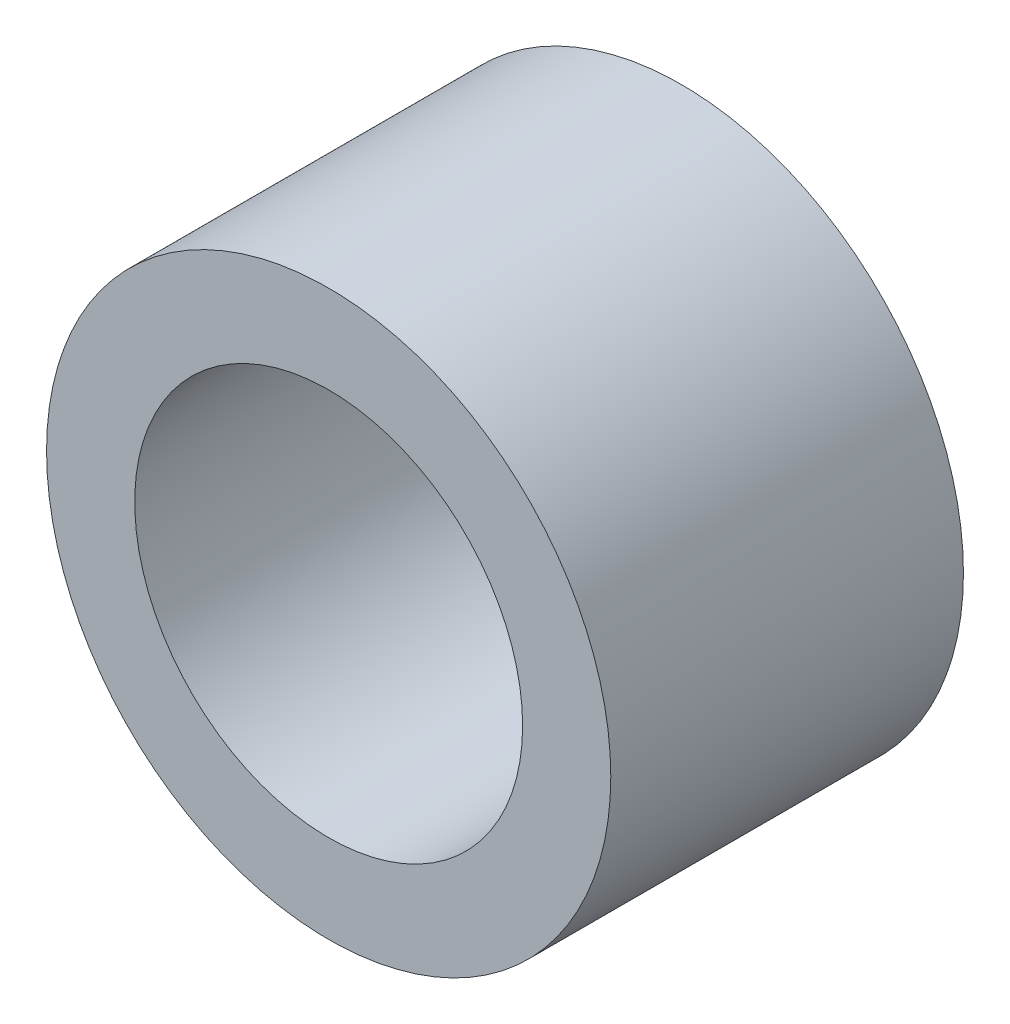
ISO-10303-21;
HEADER;
FILE_DESCRIPTION(('STEP AP214'),'2;1');
FILE_NAME('part.step','',(''),(''),'','','');
FILE_SCHEMA(('AUTOMOTIVE_DESIGN { 1 0 10303 214 1 1 1 1 }'));
ENDSEC;
DATA;
#1=APPLICATION_CONTEXT('core data for automotive mechanical design processes');
#2=APPLICATION_PROTOCOL_DEFINITION('international standard','automotive_design',2000,#1);
#3=PRODUCT_CONTEXT('',#1,'mechanical');
#4=PRODUCT('Part','Part','',(#3));
#5=PRODUCT_RELATED_PRODUCT_CATEGORY('part','',(#4));
#6=PRODUCT_DEFINITION_FORMATION('','',#4);
#7=PRODUCT_DEFINITION_CONTEXT('part definition',#1,'design');
#8=PRODUCT_DEFINITION('design','',#6,#7);
#9=PRODUCT_DEFINITION_SHAPE('','',#8);
#10=(LENGTH_UNIT() NAMED_UNIT(*) SI_UNIT(.MILLI.,.METRE.));
#11=(NAMED_UNIT(*) PLANE_ANGLE_UNIT() SI_UNIT($,.RADIAN.));
#12=(NAMED_UNIT(*) SI_UNIT($,.STERADIAN.) SOLID_ANGLE_UNIT());
#13=UNCERTAINTY_MEASURE_WITH_UNIT(LENGTH_MEASURE(1.E-05),#10,'distance_accuracy_value','');
#14=(GEOMETRIC_REPRESENTATION_CONTEXT(3) GLOBAL_UNCERTAINTY_ASSIGNED_CONTEXT((#13)) GLOBAL_UNIT_ASSIGNED_CONTEXT((#10,
#11,#12)) REPRESENTATION_CONTEXT('',''));
#15=CARTESIAN_POINT('',(0.,0.,0.));
#16=DIRECTION('',(0.,0.,1.));
#17=DIRECTION('',(1.,0.,0.));
#18=AXIS2_PLACEMENT_3D('',#15,#16,#17);
#19=CARTESIAN_POINT('',(0.,0.,5.));
#20=DIRECTION('',(0.,0.,-1.));
#21=DIRECTION('',(-1.,0.,0.));
#22=AXIS2_PLACEMENT_3D('',#19,#20,#21);
#23=CYLINDRICAL_SURFACE('',#22,4.);
#24=CARTESIAN_POINT('',(0.,0.,5.));
#25=DIRECTION('',(0.,0.,1.));
#26=DIRECTION('',(1.,0.,0.));
#27=AXIS2_PLACEMENT_3D('',#24,#25,#26);
#28=CIRCLE('',#27,4.);
#29=CARTESIAN_POINT('',(4.,0.,5.));
#30=VERTEX_POINT('',#29);
#31=EDGE_CURVE('E10',#30,#30,#28,.T.);
#32=ORIENTED_EDGE('',*,*,#31,.F.);
#33=EDGE_LOOP('',(#32));
#34=FACE_BOUND('',#33,.T.);
#35=CARTESIAN_POINT('',(0.,0.,0.));
#36=DIRECTION('',(0.,0.,1.));
#37=DIRECTION('',(1.,0.,0.));
#38=AXIS2_PLACEMENT_3D('',#35,#36,#37);
#39=CIRCLE('',#38,4.);
#40=CARTESIAN_POINT('',(4.,0.,0.));
#41=VERTEX_POINT('',#40);
#42=EDGE_CURVE('E40',#41,#41,#39,.T.);
#43=ORIENTED_EDGE('',*,*,#42,.T.);
#44=EDGE_LOOP('',(#43));
#45=FACE_BOUND('',#44,.T.);
#46=ADVANCED_FACE('F37',(#34,#45),#23,.T.);
#47=CARTESIAN_POINT('',(0.,0.,5.));
#48=DIRECTION('',(0.,0.,1.));
#49=DIRECTION('',(1.,0.,0.));
#50=AXIS2_PLACEMENT_3D('',#47,#48,#49);
#51=PLANE('',#50);
#52=CARTESIAN_POINT('',(0.,0.,5.));
#53=DIRECTION('',(0.,0.,1.));
#54=DIRECTION('',(1.,0.,0.));
#55=AXIS2_PLACEMENT_3D('',#52,#53,#54);
#56=CIRCLE('',#55,2.75);
#57=CARTESIAN_POINT('',(2.75,0.,5.));
#58=VERTEX_POINT('',#57);
#59=EDGE_CURVE('E54',#58,#58,#56,.T.);
#60=ORIENTED_EDGE('',*,*,#59,.F.);
#61=EDGE_LOOP('',(#60));
#62=FACE_BOUND('',#61,.T.);
#63=ORIENTED_EDGE('',*,*,#31,.T.);
#64=EDGE_LOOP('',(#63));
#65=FACE_BOUND('',#64,.T.);
#66=ADVANCED_FACE('F62',(#62,#65),#51,.T.);
#67=CARTESIAN_POINT('',(0.,0.,0.));
#68=DIRECTION('',(0.,0.,1.));
#69=DIRECTION('',(1.,0.,0.));
#70=AXIS2_PLACEMENT_3D('',#67,#68,#69);
#71=PLANE('',#70);
#72=CARTESIAN_POINT('',(0.,0.,0.));
#73=DIRECTION('',(0.,0.,1.));
#74=DIRECTION('',(1.,0.,0.));
#75=AXIS2_PLACEMENT_3D('',#72,#73,#74);
#76=CIRCLE('',#75,2.75);
#77=CARTESIAN_POINT('',(2.75,0.,0.));
#78=VERTEX_POINT('',#77);
#79=EDGE_CURVE('E49',#78,#78,#76,.T.);
#80=ORIENTED_EDGE('',*,*,#79,.T.);
#81=EDGE_LOOP('',(#80));
#82=FACE_BOUND('',#81,.T.);
#83=ORIENTED_EDGE('',*,*,#42,.F.);
#84=EDGE_LOOP('',(#83));
#85=FACE_BOUND('',#84,.T.);
#86=ADVANCED_FACE('F64',(#82,#85),#71,.F.);
#87=CARTESIAN_POINT('',(0.,0.,5.));
#88=DIRECTION('',(0.,0.,1.));
#89=DIRECTION('',(1.,0.,0.));
#90=AXIS2_PLACEMENT_3D('',#87,#88,#89);
#91=CYLINDRICAL_SURFACE('',#90,2.75);
#92=ORIENTED_EDGE('',*,*,#59,.T.);
#93=EDGE_LOOP('',(#92));
#94=FACE_BOUND('',#93,.T.);
#95=ORIENTED_EDGE('',*,*,#79,.F.);
#96=EDGE_LOOP('',(#95));
#97=FACE_BOUND('',#96,.T.);
#98=ADVANCED_FACE('F59',(#94,#97),#91,.F.);
#99=CLOSED_SHELL('',(#46,#66,#86,#98));
#100=MANIFOLD_SOLID_BREP('B2',#99);
#101=ADVANCED_BREP_SHAPE_REPRESENTATION('',(#18,#100),#14);
#102=SHAPE_DEFINITION_REPRESENTATION(#9,#101);
ENDSEC;
END-ISO-10303-21;
